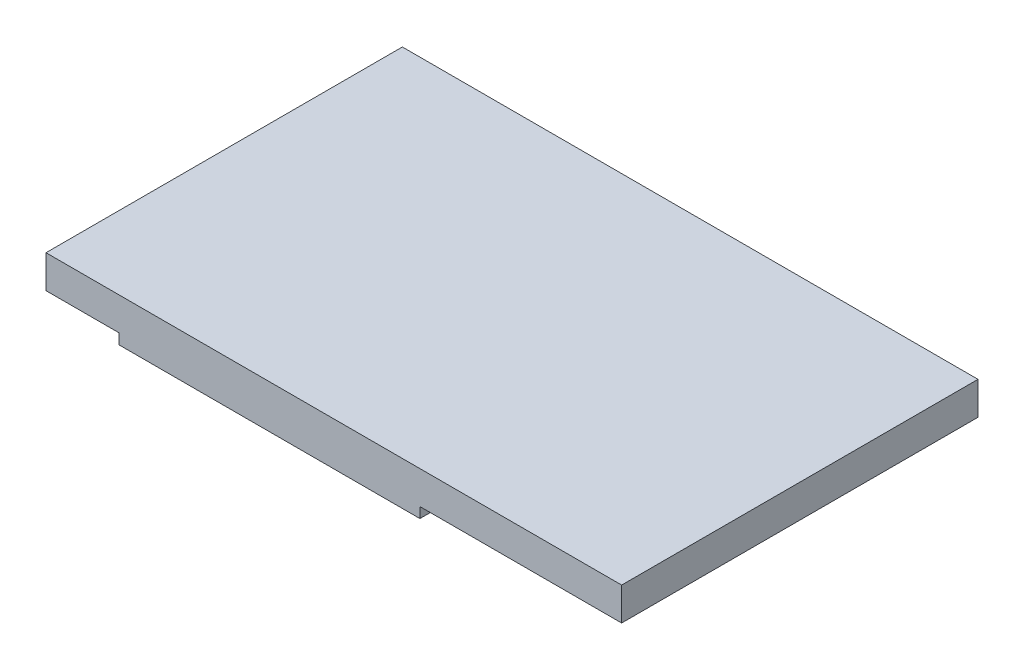
ISO-10303-21;
HEADER;
FILE_DESCRIPTION(('STEP AP214'),'2;1');
FILE_NAME('part.step','',(''),(''),'','','');
FILE_SCHEMA(('AUTOMOTIVE_DESIGN { 1 0 10303 214 1 1 1 1 }'));
ENDSEC;
DATA;
#1=APPLICATION_CONTEXT('core data for automotive mechanical design processes');
#2=APPLICATION_PROTOCOL_DEFINITION('international standard','automotive_design',2000,#1);
#3=PRODUCT_CONTEXT('',#1,'mechanical');
#4=PRODUCT('Part','Part','',(#3));
#5=PRODUCT_RELATED_PRODUCT_CATEGORY('part','',(#4));
#6=PRODUCT_DEFINITION_FORMATION('','',#4);
#7=PRODUCT_DEFINITION_CONTEXT('part definition',#1,'design');
#8=PRODUCT_DEFINITION('design','',#6,#7);
#9=PRODUCT_DEFINITION_SHAPE('','',#8);
#10=(LENGTH_UNIT() NAMED_UNIT(*) SI_UNIT(.MILLI.,.METRE.));
#11=(NAMED_UNIT(*) PLANE_ANGLE_UNIT() SI_UNIT($,.RADIAN.));
#12=(NAMED_UNIT(*) SI_UNIT($,.STERADIAN.) SOLID_ANGLE_UNIT());
#13=UNCERTAINTY_MEASURE_WITH_UNIT(LENGTH_MEASURE(1.E-05),#10,'distance_accuracy_value','');
#14=(GEOMETRIC_REPRESENTATION_CONTEXT(3) GLOBAL_UNCERTAINTY_ASSIGNED_CONTEXT((#13)) GLOBAL_UNIT_ASSIGNED_CONTEXT((#10,
#11,#12)) REPRESENTATION_CONTEXT('',''));
#15=CARTESIAN_POINT('',(0.,0.,0.));
#16=DIRECTION('',(0.,0.,1.));
#17=DIRECTION('',(1.,0.,0.));
#18=AXIS2_PLACEMENT_3D('',#15,#16,#17);
#19=CARTESIAN_POINT('',(0.,-1.9,0.));
#20=DIRECTION('',(0.,-1.,0.));
#21=DIRECTION('',(0.,0.,-1.));
#22=AXIS2_PLACEMENT_3D('',#19,#20,#21);
#23=PLANE('',#22);
#24=DIRECTION('',(0.,0.,-1.));
#25=VECTOR('',#24,1.);
#26=CARTESIAN_POINT('',(-39.2,-1.9,32.5));
#27=LINE('',#26,#25);
#28=CARTESIAN_POINT('',(-39.2,-1.9,32.5));
#29=VERTEX_POINT('',#28);
#30=CARTESIAN_POINT('',(-39.2,-1.9,-32.5));
#31=VERTEX_POINT('',#30);
#32=EDGE_CURVE('E239',#29,#31,#27,.T.);
#33=ORIENTED_EDGE('',*,*,#32,.T.);
#34=DIRECTION('',(1.,0.,0.));
#35=VECTOR('',#34,1.);
#36=CARTESIAN_POINT('',(-39.2,-1.9,-32.5));
#37=LINE('',#36,#35);
#38=CARTESIAN_POINT('',(15.7,-1.9,-32.5));
#39=VERTEX_POINT('',#38);
#40=EDGE_CURVE('E243',#31,#39,#37,.T.);
#41=ORIENTED_EDGE('',*,*,#40,.T.);
#42=DIRECTION('',(0.,0.,1.));
#43=VECTOR('',#42,1.);
#44=CARTESIAN_POINT('',(15.7,-1.9,32.5));
#45=LINE('',#44,#43);
#46=CARTESIAN_POINT('',(15.7,-1.9,32.5));
#47=VERTEX_POINT('',#46);
#48=EDGE_CURVE('E247',#39,#47,#45,.T.);
#49=ORIENTED_EDGE('',*,*,#48,.T.);
#50=DIRECTION('',(-1.,0.,0.));
#51=VECTOR('',#50,1.);
#52=CARTESIAN_POINT('',(-39.2,-1.9,32.5));
#53=LINE('',#52,#51);
#54=EDGE_CURVE('E250',#47,#29,#53,.T.);
#55=ORIENTED_EDGE('',*,*,#54,.T.);
#56=EDGE_LOOP('',(#33,#41,#49,#55));
#57=FACE_BOUND('',#56,.T.);
#58=DIRECTION('',(1.,0.,0.));
#59=VECTOR('',#58,1.);
#60=CARTESIAN_POINT('',(-35.9,-1.9,2.99999999999999));
#61=LINE('',#60,#59);
#62=CARTESIAN_POINT('',(-35.9,-1.9,2.99999999999999));
#63=VERTEX_POINT('',#62);
#64=CARTESIAN_POINT('',(-33.5,-1.9,2.99999999999999));
#65=VERTEX_POINT('',#64);
#66=EDGE_CURVE('E189',#63,#65,#61,.T.);
#67=ORIENTED_EDGE('',*,*,#66,.F.);
#68=DIRECTION('',(0.,0.,-1.));
#69=VECTOR('',#68,1.);
#70=CARTESIAN_POINT('',(-35.9,-1.9,27.2));
#71=LINE('',#70,#69);
#72=CARTESIAN_POINT('',(-35.9,-1.9,27.2));
#73=VERTEX_POINT('',#72);
#74=EDGE_CURVE('E184',#73,#63,#71,.T.);
#75=ORIENTED_EDGE('',*,*,#74,.F.);
#76=DIRECTION('',(-1.,0.,0.));
#77=VECTOR('',#76,1.);
#78=CARTESIAN_POINT('',(-35.9,-1.9,27.2));
#79=LINE('',#78,#77);
#80=CARTESIAN_POINT('',(-33.5,-1.9,27.2));
#81=VERTEX_POINT('',#80);
#82=EDGE_CURVE('E209',#81,#73,#79,.T.);
#83=ORIENTED_EDGE('',*,*,#82,.F.);
#84=DIRECTION('',(0.,0.,1.));
#85=VECTOR('',#84,1.);
#86=CARTESIAN_POINT('',(-33.5,-1.9,27.2));
#87=LINE('',#86,#85);
#88=EDGE_CURVE('E221',#65,#81,#87,.T.);
#89=ORIENTED_EDGE('',*,*,#88,.F.);
#90=EDGE_LOOP('',(#67,#75,#83,#89));
#91=FACE_BOUND('',#90,.T.);
#92=DIRECTION('',(1.,0.,0.));
#93=VECTOR('',#92,1.);
#94=CARTESIAN_POINT('',(8.2539363114903,-1.9,-12.5));
#95=LINE('',#94,#93);
#96=CARTESIAN_POINT('',(8.2539363114903,-1.9,-12.5));
#97=VERTEX_POINT('',#96);
#98=CARTESIAN_POINT('',(10.6539363114903,-1.9,-12.5));
#99=VERTEX_POINT('',#98);
#100=EDGE_CURVE('E182',#97,#99,#95,.T.);
#101=ORIENTED_EDGE('',*,*,#100,.F.);
#102=DIRECTION('',(0.,0.,-1.));
#103=VECTOR('',#102,1.);
#104=CARTESIAN_POINT('',(8.2539363114903,-1.9,27.2));
#105=LINE('',#104,#103);
#106=CARTESIAN_POINT('',(8.2539363114903,-1.9,27.2));
#107=VERTEX_POINT('',#106);
#108=EDGE_CURVE('E176',#107,#97,#105,.T.);
#109=ORIENTED_EDGE('',*,*,#108,.F.);
#110=DIRECTION('',(-1.,0.,0.));
#111=VECTOR('',#110,1.);
#112=CARTESIAN_POINT('',(8.2539363114903,-1.9,27.2));
#113=LINE('',#112,#111);
#114=CARTESIAN_POINT('',(10.6539363114903,-1.9,27.2));
#115=VERTEX_POINT('',#114);
#116=EDGE_CURVE('E160',#115,#107,#113,.T.);
#117=ORIENTED_EDGE('',*,*,#116,.F.);
#118=DIRECTION('',(0.,0.,1.));
#119=VECTOR('',#118,1.);
#120=CARTESIAN_POINT('',(10.6539363114903,-1.9,27.2));
#121=LINE('',#120,#119);
#122=EDGE_CURVE('E169',#99,#115,#121,.T.);
#123=ORIENTED_EDGE('',*,*,#122,.F.);
#124=EDGE_LOOP('',(#101,#109,#117,#123));
#125=FACE_BOUND('',#124,.T.);
#126=ADVANCED_FACE('F45',(#57,#91,#125),#23,.T.);
#127=CARTESIAN_POINT('',(0.,0.,0.));
#128=DIRECTION('',(0.,1.,0.));
#129=DIRECTION('',(0.,0.,1.));
#130=AXIS2_PLACEMENT_3D('',#127,#128,#129);
#131=PLANE('',#130);
#132=DIRECTION('',(0.,0.,-1.));
#133=VECTOR('',#132,1.);
#134=CARTESIAN_POINT('',(-39.2,0.,32.5));
#135=LINE('',#134,#133);
#136=CARTESIAN_POINT('',(-39.2,0.,32.5));
#137=VERTEX_POINT('',#136);
#138=CARTESIAN_POINT('',(-39.2,0.,-32.5));
#139=VERTEX_POINT('',#138);
#140=EDGE_CURVE('E238',#137,#139,#135,.T.);
#141=ORIENTED_EDGE('',*,*,#140,.F.);
#142=DIRECTION('',(1.,0.,0.));
#143=VECTOR('',#142,1.);
#144=CARTESIAN_POINT('',(52.5,0.,32.5));
#145=LINE('',#144,#143);
#146=CARTESIAN_POINT('',(-52.5,0.,32.5));
#147=VERTEX_POINT('',#146);
#148=EDGE_CURVE('E295',#147,#137,#145,.T.);
#149=ORIENTED_EDGE('',*,*,#148,.F.);
#150=DIRECTION('',(0.,0.,1.));
#151=VECTOR('',#150,1.);
#152=CARTESIAN_POINT('',(-52.5,0.,32.5));
#153=LINE('',#152,#151);
#154=CARTESIAN_POINT('',(-52.5,0.,-32.5));
#155=VERTEX_POINT('',#154);
#156=EDGE_CURVE('E275',#155,#147,#153,.T.);
#157=ORIENTED_EDGE('',*,*,#156,.F.);
#158=DIRECTION('',(-1.,0.,0.));
#159=VECTOR('',#158,1.);
#160=CARTESIAN_POINT('',(52.5,0.,-32.5));
#161=LINE('',#160,#159);
#162=EDGE_CURVE('E302',#139,#155,#161,.T.);
#163=ORIENTED_EDGE('',*,*,#162,.F.);
#164=EDGE_LOOP('',(#141,#149,#157,#163));
#165=FACE_BOUND('',#164,.T.);
#166=ADVANCED_FACE('F342',(#165),#131,.F.);
#167=DIRECTION('',(0.,0.,1.));
#168=VECTOR('',#167,1.);
#169=CARTESIAN_POINT('',(15.7,0.,32.5));
#170=LINE('',#169,#168);
#171=CARTESIAN_POINT('',(15.7,0.,-32.5));
#172=VERTEX_POINT('',#171);
#173=CARTESIAN_POINT('',(15.7,0.,32.5));
#174=VERTEX_POINT('',#173);
#175=EDGE_CURVE('E244',#172,#174,#170,.T.);
#176=ORIENTED_EDGE('',*,*,#175,.F.);
#177=CARTESIAN_POINT('',(52.5,0.,-32.5));
#178=VERTEX_POINT('',#177);
#179=EDGE_CURVE('E281',#178,#172,#161,.T.);
#180=ORIENTED_EDGE('',*,*,#179,.F.);
#181=DIRECTION('',(0.,0.,-1.));
#182=VECTOR('',#181,1.);
#183=CARTESIAN_POINT('',(52.5,0.,32.5));
#184=LINE('',#183,#182);
#185=CARTESIAN_POINT('',(52.5,0.,32.5));
#186=VERTEX_POINT('',#185);
#187=EDGE_CURVE('E299',#186,#178,#184,.T.);
#188=ORIENTED_EDGE('',*,*,#187,.F.);
#189=EDGE_CURVE('E294',#174,#186,#145,.T.);
#190=ORIENTED_EDGE('',*,*,#189,.F.);
#191=EDGE_LOOP('',(#176,#180,#188,#190));
#192=FACE_BOUND('',#191,.T.);
#193=ADVANCED_FACE('F323',(#192),#131,.F.);
#194=CARTESIAN_POINT('',(-52.5,6.,32.5));
#195=DIRECTION('',(1.,0.,0.));
#196=DIRECTION('',(0.,0.,-1.));
#197=AXIS2_PLACEMENT_3D('',#194,#195,#196);
#198=PLANE('',#197);
#199=ORIENTED_EDGE('',*,*,#156,.T.);
#200=DIRECTION('',(0.,-1.,0.));
#201=VECTOR('',#200,1.);
#202=CARTESIAN_POINT('',(-52.5,6.,32.5));
#203=LINE('',#202,#201);
#204=CARTESIAN_POINT('',(-52.5,6.,32.5));
#205=VERTEX_POINT('',#204);
#206=EDGE_CURVE('E11',#205,#147,#203,.T.);
#207=ORIENTED_EDGE('',*,*,#206,.F.);
#208=DIRECTION('',(0.,0.,1.));
#209=VECTOR('',#208,1.);
#210=CARTESIAN_POINT('',(-52.5,6.,32.5));
#211=LINE('',#210,#209);
#212=CARTESIAN_POINT('',(-52.5,6.,-32.5));
#213=VERTEX_POINT('',#212);
#214=EDGE_CURVE('E276',#213,#205,#211,.T.);
#215=ORIENTED_EDGE('',*,*,#214,.F.);
#216=DIRECTION('',(0.,-1.,0.));
#217=VECTOR('',#216,1.);
#218=CARTESIAN_POINT('',(-52.5,6.,-32.5));
#219=LINE('',#218,#217);
#220=EDGE_CURVE('E290',#213,#155,#219,.T.);
#221=ORIENTED_EDGE('',*,*,#220,.T.);
#222=EDGE_LOOP('',(#199,#207,#215,#221));
#223=FACE_BOUND('',#222,.T.);
#224=ADVANCED_FACE('F47',(#223),#198,.F.);
#225=CARTESIAN_POINT('',(52.5,6.,32.5));
#226=DIRECTION('',(0.,0.,-1.));
#227=DIRECTION('',(-1.,0.,0.));
#228=AXIS2_PLACEMENT_3D('',#225,#226,#227);
#229=PLANE('',#228);
#230=ORIENTED_EDGE('',*,*,#148,.T.);
#231=DIRECTION('',(0.,1.,0.));
#232=VECTOR('',#231,1.);
#233=CARTESIAN_POINT('',(-39.2,-1.9,32.5));
#234=LINE('',#233,#232);
#235=EDGE_CURVE('E253',#29,#137,#234,.T.);
#236=ORIENTED_EDGE('',*,*,#235,.F.);
#237=ORIENTED_EDGE('',*,*,#54,.F.);
#238=DIRECTION('',(0.,1.,0.));
#239=VECTOR('',#238,1.);
#240=CARTESIAN_POINT('',(15.7,-1.9,32.5));
#241=LINE('',#240,#239);
#242=EDGE_CURVE('E263',#47,#174,#241,.T.);
#243=ORIENTED_EDGE('',*,*,#242,.T.);
#244=ORIENTED_EDGE('',*,*,#189,.T.);
#245=DIRECTION('',(0.,-1.,0.));
#246=VECTOR('',#245,1.);
#247=CARTESIAN_POINT('',(52.5,6.,32.5));
#248=LINE('',#247,#246);
#249=CARTESIAN_POINT('',(52.5,6.,32.5));
#250=VERTEX_POINT('',#249);
#251=EDGE_CURVE('E54',#250,#186,#248,.T.);
#252=ORIENTED_EDGE('',*,*,#251,.F.);
#253=DIRECTION('',(1.,0.,0.));
#254=VECTOR('',#253,1.);
#255=CARTESIAN_POINT('',(52.5,6.,32.5));
#256=LINE('',#255,#254);
#257=EDGE_CURVE('E280',#205,#250,#256,.T.);
#258=ORIENTED_EDGE('',*,*,#257,.F.);
#259=ORIENTED_EDGE('',*,*,#206,.T.);
#260=EDGE_LOOP('',(#230,#236,#237,#243,#244,#252,#258,#259));
#261=FACE_BOUND('',#260,.T.);
#262=ADVANCED_FACE('F344',(#261),#229,.F.);
#263=CARTESIAN_POINT('',(52.5,6.,32.5));
#264=DIRECTION('',(-1.,0.,0.));
#265=DIRECTION('',(0.,0.,1.));
#266=AXIS2_PLACEMENT_3D('',#263,#264,#265);
#267=PLANE('',#266);
#268=ORIENTED_EDGE('',*,*,#187,.T.);
#269=DIRECTION('',(0.,-1.,0.));
#270=VECTOR('',#269,1.);
#271=CARTESIAN_POINT('',(52.5,6.,-32.5));
#272=LINE('',#271,#270);
#273=CARTESIAN_POINT('',(52.5,6.,-32.5));
#274=VERTEX_POINT('',#273);
#275=EDGE_CURVE('E309',#274,#178,#272,.T.);
#276=ORIENTED_EDGE('',*,*,#275,.F.);
#277=DIRECTION('',(0.,0.,-1.));
#278=VECTOR('',#277,1.);
#279=CARTESIAN_POINT('',(52.5,6.,32.5));
#280=LINE('',#279,#278);
#281=EDGE_CURVE('E284',#250,#274,#280,.T.);
#282=ORIENTED_EDGE('',*,*,#281,.F.);
#283=ORIENTED_EDGE('',*,*,#251,.T.);
#284=EDGE_LOOP('',(#268,#276,#282,#283));
#285=FACE_BOUND('',#284,.T.);
#286=ADVANCED_FACE('F318',(#285),#267,.F.);
#287=CARTESIAN_POINT('',(52.5,6.,-32.5));
#288=DIRECTION('',(0.,0.,1.));
#289=DIRECTION('',(1.,0.,0.));
#290=AXIS2_PLACEMENT_3D('',#287,#288,#289);
#291=PLANE('',#290);
#292=ORIENTED_EDGE('',*,*,#179,.T.);
#293=DIRECTION('',(0.,1.,0.));
#294=VECTOR('',#293,1.);
#295=CARTESIAN_POINT('',(15.7,-1.9,-32.5));
#296=LINE('',#295,#294);
#297=EDGE_CURVE('E267',#39,#172,#296,.T.);
#298=ORIENTED_EDGE('',*,*,#297,.F.);
#299=ORIENTED_EDGE('',*,*,#40,.F.);
#300=DIRECTION('',(0.,1.,0.));
#301=VECTOR('',#300,1.);
#302=CARTESIAN_POINT('',(-39.2,-1.9,-32.5));
#303=LINE('',#302,#301);
#304=EDGE_CURVE('E271',#31,#139,#303,.T.);
#305=ORIENTED_EDGE('',*,*,#304,.T.);
#306=ORIENTED_EDGE('',*,*,#162,.T.);
#307=ORIENTED_EDGE('',*,*,#220,.F.);
#308=DIRECTION('',(-1.,0.,0.));
#309=VECTOR('',#308,1.);
#310=CARTESIAN_POINT('',(52.5,6.,-32.5));
#311=LINE('',#310,#309);
#312=EDGE_CURVE('E287',#274,#213,#311,.T.);
#313=ORIENTED_EDGE('',*,*,#312,.F.);
#314=ORIENTED_EDGE('',*,*,#275,.T.);
#315=EDGE_LOOP('',(#292,#298,#299,#305,#306,#307,#313,#314));
#316=FACE_BOUND('',#315,.T.);
#317=ADVANCED_FACE('F326',(#316),#291,.F.);
#318=CARTESIAN_POINT('',(0.,6.,0.));
#319=DIRECTION('',(0.,1.,0.));
#320=DIRECTION('',(0.,0.,1.));
#321=AXIS2_PLACEMENT_3D('',#318,#319,#320);
#322=PLANE('',#321);
#323=ORIENTED_EDGE('',*,*,#214,.T.);
#324=ORIENTED_EDGE('',*,*,#257,.T.);
#325=ORIENTED_EDGE('',*,*,#281,.T.);
#326=ORIENTED_EDGE('',*,*,#312,.T.);
#327=EDGE_LOOP('',(#323,#324,#325,#326));
#328=FACE_BOUND('',#327,.T.);
#329=ADVANCED_FACE('F349',(#328),#322,.T.);
#330=CARTESIAN_POINT('',(-39.2,-1.9,32.5));
#331=DIRECTION('',(1.,0.,0.));
#332=DIRECTION('',(0.,0.,-1.));
#333=AXIS2_PLACEMENT_3D('',#330,#331,#332);
#334=PLANE('',#333);
#335=ORIENTED_EDGE('',*,*,#140,.T.);
#336=ORIENTED_EDGE('',*,*,#304,.F.);
#337=ORIENTED_EDGE('',*,*,#32,.F.);
#338=ORIENTED_EDGE('',*,*,#235,.T.);
#339=EDGE_LOOP('',(#335,#336,#337,#338));
#340=FACE_BOUND('',#339,.T.);
#341=ADVANCED_FACE('F340',(#340),#334,.F.);
#342=CARTESIAN_POINT('',(15.7,-1.9,32.5));
#343=DIRECTION('',(-1.,0.,0.));
#344=DIRECTION('',(0.,0.,1.));
#345=AXIS2_PLACEMENT_3D('',#342,#343,#344);
#346=PLANE('',#345);
#347=ORIENTED_EDGE('',*,*,#175,.T.);
#348=ORIENTED_EDGE('',*,*,#242,.F.);
#349=ORIENTED_EDGE('',*,*,#48,.F.);
#350=ORIENTED_EDGE('',*,*,#297,.T.);
#351=EDGE_LOOP('',(#347,#348,#349,#350));
#352=FACE_BOUND('',#351,.T.);
#353=ADVANCED_FACE('F330',(#352),#346,.F.);
#354=CARTESIAN_POINT('',(-35.9,-5.,27.2));
#355=DIRECTION('',(1.,0.,0.));
#356=DIRECTION('',(0.,0.,-1.));
#357=AXIS2_PLACEMENT_3D('',#354,#355,#356);
#358=PLANE('',#357);
#359=ORIENTED_EDGE('',*,*,#74,.T.);
#360=DIRECTION('',(0.,1.,0.));
#361=VECTOR('',#360,1.);
#362=CARTESIAN_POINT('',(-35.9,-5.,2.99999999999999));
#363=LINE('',#362,#361);
#364=CARTESIAN_POINT('',(-35.9,-5.,2.99999999999999));
#365=VERTEX_POINT('',#364);
#366=EDGE_CURVE('E235',#365,#63,#363,.T.);
#367=ORIENTED_EDGE('',*,*,#366,.F.);
#368=DIRECTION('',(0.,0.,-1.));
#369=VECTOR('',#368,1.);
#370=CARTESIAN_POINT('',(-35.9,-5.,27.2));
#371=LINE('',#370,#369);
#372=CARTESIAN_POINT('',(-35.9,-5.,27.2));
#373=VERTEX_POINT('',#372);
#374=EDGE_CURVE('E204',#373,#365,#371,.T.);
#375=ORIENTED_EDGE('',*,*,#374,.F.);
#376=DIRECTION('',(0.,1.,0.));
#377=VECTOR('',#376,1.);
#378=CARTESIAN_POINT('',(-35.9,-5.,27.2));
#379=LINE('',#378,#377);
#380=EDGE_CURVE('E217',#373,#73,#379,.T.);
#381=ORIENTED_EDGE('',*,*,#380,.T.);
#382=EDGE_LOOP('',(#359,#367,#375,#381));
#383=FACE_BOUND('',#382,.T.);
#384=ADVANCED_FACE('F369',(#383),#358,.F.);
#385=CARTESIAN_POINT('',(-35.9,-5.,2.99999999999999));
#386=DIRECTION('',(0.,0.,1.));
#387=DIRECTION('',(1.,0.,0.));
#388=AXIS2_PLACEMENT_3D('',#385,#386,#387);
#389=PLANE('',#388);
#390=ORIENTED_EDGE('',*,*,#66,.T.);
#391=DIRECTION('',(0.,1.,0.));
#392=VECTOR('',#391,1.);
#393=CARTESIAN_POINT('',(-33.5,-5.,2.99999999999999));
#394=LINE('',#393,#392);
#395=CARTESIAN_POINT('',(-33.5,-5.,2.99999999999999));
#396=VERTEX_POINT('',#395);
#397=EDGE_CURVE('E231',#396,#65,#394,.T.);
#398=ORIENTED_EDGE('',*,*,#397,.F.);
#399=DIRECTION('',(1.,0.,0.));
#400=VECTOR('',#399,1.);
#401=CARTESIAN_POINT('',(-35.9,-5.,2.99999999999999));
#402=LINE('',#401,#400);
#403=EDGE_CURVE('E208',#365,#396,#402,.T.);
#404=ORIENTED_EDGE('',*,*,#403,.F.);
#405=ORIENTED_EDGE('',*,*,#366,.T.);
#406=EDGE_LOOP('',(#390,#398,#404,#405));
#407=FACE_BOUND('',#406,.T.);
#408=ADVANCED_FACE('F373',(#407),#389,.F.);
#409=CARTESIAN_POINT('',(-33.5,-5.,27.2));
#410=DIRECTION('',(-1.,0.,0.));
#411=DIRECTION('',(0.,0.,1.));
#412=AXIS2_PLACEMENT_3D('',#409,#410,#411);
#413=PLANE('',#412);
#414=ORIENTED_EDGE('',*,*,#88,.T.);
#415=DIRECTION('',(0.,1.,0.));
#416=VECTOR('',#415,1.);
#417=CARTESIAN_POINT('',(-33.5,-5.,27.2));
#418=LINE('',#417,#416);
#419=CARTESIAN_POINT('',(-33.5,-5.,27.2));
#420=VERTEX_POINT('',#419);
#421=EDGE_CURVE('E69',#420,#81,#418,.T.);
#422=ORIENTED_EDGE('',*,*,#421,.F.);
#423=DIRECTION('',(0.,0.,1.));
#424=VECTOR('',#423,1.);
#425=CARTESIAN_POINT('',(-33.5,-5.,27.2));
#426=LINE('',#425,#424);
#427=EDGE_CURVE('E212',#396,#420,#426,.T.);
#428=ORIENTED_EDGE('',*,*,#427,.F.);
#429=ORIENTED_EDGE('',*,*,#397,.T.);
#430=EDGE_LOOP('',(#414,#422,#428,#429));
#431=FACE_BOUND('',#430,.T.);
#432=ADVANCED_FACE('F378',(#431),#413,.F.);
#433=CARTESIAN_POINT('',(-35.9,-5.,27.2));
#434=DIRECTION('',(0.,0.,-1.));
#435=DIRECTION('',(-1.,0.,0.));
#436=AXIS2_PLACEMENT_3D('',#433,#434,#435);
#437=PLANE('',#436);
#438=ORIENTED_EDGE('',*,*,#82,.T.);
#439=ORIENTED_EDGE('',*,*,#380,.F.);
#440=DIRECTION('',(-1.,0.,0.));
#441=VECTOR('',#440,1.);
#442=CARTESIAN_POINT('',(-35.9,-5.,27.2));
#443=LINE('',#442,#441);
#444=EDGE_CURVE('E215',#420,#373,#443,.T.);
#445=ORIENTED_EDGE('',*,*,#444,.F.);
#446=ORIENTED_EDGE('',*,*,#421,.T.);
#447=EDGE_LOOP('',(#438,#439,#445,#446));
#448=FACE_BOUND('',#447,.T.);
#449=ADVANCED_FACE('F392',(#448),#437,.F.);
#450=CARTESIAN_POINT('',(0.,-5.,0.));
#451=DIRECTION('',(0.,-1.,0.));
#452=DIRECTION('',(0.,0.,-1.));
#453=AXIS2_PLACEMENT_3D('',#450,#451,#452);
#454=PLANE('',#453);
#455=ORIENTED_EDGE('',*,*,#374,.T.);
#456=ORIENTED_EDGE('',*,*,#403,.T.);
#457=ORIENTED_EDGE('',*,*,#427,.T.);
#458=ORIENTED_EDGE('',*,*,#444,.T.);
#459=EDGE_LOOP('',(#455,#456,#457,#458));
#460=FACE_BOUND('',#459,.T.);
#461=ADVANCED_FACE('F391',(#460),#454,.T.);
#462=CARTESIAN_POINT('',(8.2539363114903,-5.,27.2));
#463=DIRECTION('',(1.,0.,0.));
#464=DIRECTION('',(0.,0.,-1.));
#465=AXIS2_PLACEMENT_3D('',#462,#463,#464);
#466=PLANE('',#465);
#467=ORIENTED_EDGE('',*,*,#108,.T.);
#468=DIRECTION('',(0.,1.,0.));
#469=VECTOR('',#468,1.);
#470=CARTESIAN_POINT('',(8.2539363114903,-5.,-12.5));
#471=LINE('',#470,#469);
#472=CARTESIAN_POINT('',(8.2539363114903,-5.,-12.5));
#473=VERTEX_POINT('',#472);
#474=EDGE_CURVE('E541',#473,#97,#471,.T.);
#475=ORIENTED_EDGE('',*,*,#474,.F.);
#476=DIRECTION('',(0.,0.,-1.));
#477=VECTOR('',#476,1.);
#478=CARTESIAN_POINT('',(8.2539363114903,-5.,27.2));
#479=LINE('',#478,#477);
#480=CARTESIAN_POINT('',(8.2539363114903,-5.,27.2));
#481=VERTEX_POINT('',#480);
#482=EDGE_CURVE('E170',#481,#473,#479,.T.);
#483=ORIENTED_EDGE('',*,*,#482,.F.);
#484=DIRECTION('',(0.,1.,0.));
#485=VECTOR('',#484,1.);
#486=CARTESIAN_POINT('',(8.2539363114903,-5.,27.2));
#487=LINE('',#486,#485);
#488=EDGE_CURVE('E163',#481,#107,#487,.T.);
#489=ORIENTED_EDGE('',*,*,#488,.T.);
#490=EDGE_LOOP('',(#467,#475,#483,#489));
#491=FACE_BOUND('',#490,.T.);
#492=ADVANCED_FACE('F174',(#491),#466,.F.);
#493=CARTESIAN_POINT('',(8.2539363114903,-5.,-12.5));
#494=DIRECTION('',(0.,0.,1.));
#495=DIRECTION('',(1.,0.,0.));
#496=AXIS2_PLACEMENT_3D('',#493,#494,#495);
#497=PLANE('',#496);
#498=ORIENTED_EDGE('',*,*,#100,.T.);
#499=DIRECTION('',(0.,1.,0.));
#500=VECTOR('',#499,1.);
#501=CARTESIAN_POINT('',(10.6539363114903,-5.,-12.5));
#502=LINE('',#501,#500);
#503=CARTESIAN_POINT('',(10.6539363114903,-5.,-12.5));
#504=VERTEX_POINT('',#503);
#505=EDGE_CURVE('E539',#504,#99,#502,.T.);
#506=ORIENTED_EDGE('',*,*,#505,.F.);
#507=DIRECTION('',(1.,0.,0.));
#508=VECTOR('',#507,1.);
#509=CARTESIAN_POINT('',(8.2539363114903,-5.,-12.5));
#510=LINE('',#509,#508);
#511=EDGE_CURVE('E199',#473,#504,#510,.T.);
#512=ORIENTED_EDGE('',*,*,#511,.F.);
#513=ORIENTED_EDGE('',*,*,#474,.T.);
#514=EDGE_LOOP('',(#498,#506,#512,#513));
#515=FACE_BOUND('',#514,.T.);
#516=ADVANCED_FACE('F411',(#515),#497,.F.);
#517=CARTESIAN_POINT('',(10.6539363114903,-5.,27.2));
#518=DIRECTION('',(-1.,0.,0.));
#519=DIRECTION('',(0.,0.,1.));
#520=AXIS2_PLACEMENT_3D('',#517,#518,#519);
#521=PLANE('',#520);
#522=ORIENTED_EDGE('',*,*,#122,.T.);
#523=DIRECTION('',(0.,1.,0.));
#524=VECTOR('',#523,1.);
#525=CARTESIAN_POINT('',(10.6539363114903,-5.,27.2));
#526=LINE('',#525,#524);
#527=CARTESIAN_POINT('',(10.6539363114903,-5.,27.2));
#528=VERTEX_POINT('',#527);
#529=EDGE_CURVE('E61',#528,#115,#526,.T.);
#530=ORIENTED_EDGE('',*,*,#529,.F.);
#531=DIRECTION('',(0.,0.,1.));
#532=VECTOR('',#531,1.);
#533=CARTESIAN_POINT('',(10.6539363114903,-5.,27.2));
#534=LINE('',#533,#532);
#535=EDGE_CURVE('E196',#504,#528,#534,.T.);
#536=ORIENTED_EDGE('',*,*,#535,.F.);
#537=ORIENTED_EDGE('',*,*,#505,.T.);
#538=EDGE_LOOP('',(#522,#530,#536,#537));
#539=FACE_BOUND('',#538,.T.);
#540=ADVANCED_FACE('F408',(#539),#521,.F.);
#541=CARTESIAN_POINT('',(8.2539363114903,-5.,27.2));
#542=DIRECTION('',(0.,0.,-1.));
#543=DIRECTION('',(-1.,0.,0.));
#544=AXIS2_PLACEMENT_3D('',#541,#542,#543);
#545=PLANE('',#544);
#546=ORIENTED_EDGE('',*,*,#116,.T.);
#547=ORIENTED_EDGE('',*,*,#488,.F.);
#548=DIRECTION('',(-1.,0.,0.));
#549=VECTOR('',#548,1.);
#550=CARTESIAN_POINT('',(8.2539363114903,-5.,27.2));
#551=LINE('',#550,#549);
#552=EDGE_CURVE('E180',#528,#481,#551,.T.);
#553=ORIENTED_EDGE('',*,*,#552,.F.);
#554=ORIENTED_EDGE('',*,*,#529,.T.);
#555=EDGE_LOOP('',(#546,#547,#553,#554));
#556=FACE_BOUND('',#555,.T.);
#557=ADVANCED_FACE('F162',(#556),#545,.F.);
#558=CARTESIAN_POINT('',(0.,-5.,0.));
#559=DIRECTION('',(0.,-1.,0.));
#560=DIRECTION('',(0.,0.,-1.));
#561=AXIS2_PLACEMENT_3D('',#558,#559,#560);
#562=PLANE('',#561);
#563=ORIENTED_EDGE('',*,*,#482,.T.);
#564=ORIENTED_EDGE('',*,*,#511,.T.);
#565=ORIENTED_EDGE('',*,*,#535,.T.);
#566=ORIENTED_EDGE('',*,*,#552,.T.);
#567=EDGE_LOOP('',(#563,#564,#565,#566));
#568=FACE_BOUND('',#567,.T.);
#569=ADVANCED_FACE('F402',(#568),#562,.T.);
#570=CLOSED_SHELL('',(#126,#166,#193,#224,#262,#286,#317,#329,#341,#353,#384,#408,#432,#449,
#461,#492,#516,#540,#557,#569));
#571=MANIFOLD_SOLID_BREP('B2',#570);
#572=ADVANCED_BREP_SHAPE_REPRESENTATION('',(#18,#571),#14);
#573=SHAPE_DEFINITION_REPRESENTATION(#9,#572);
ENDSEC;
END-ISO-10303-21;
